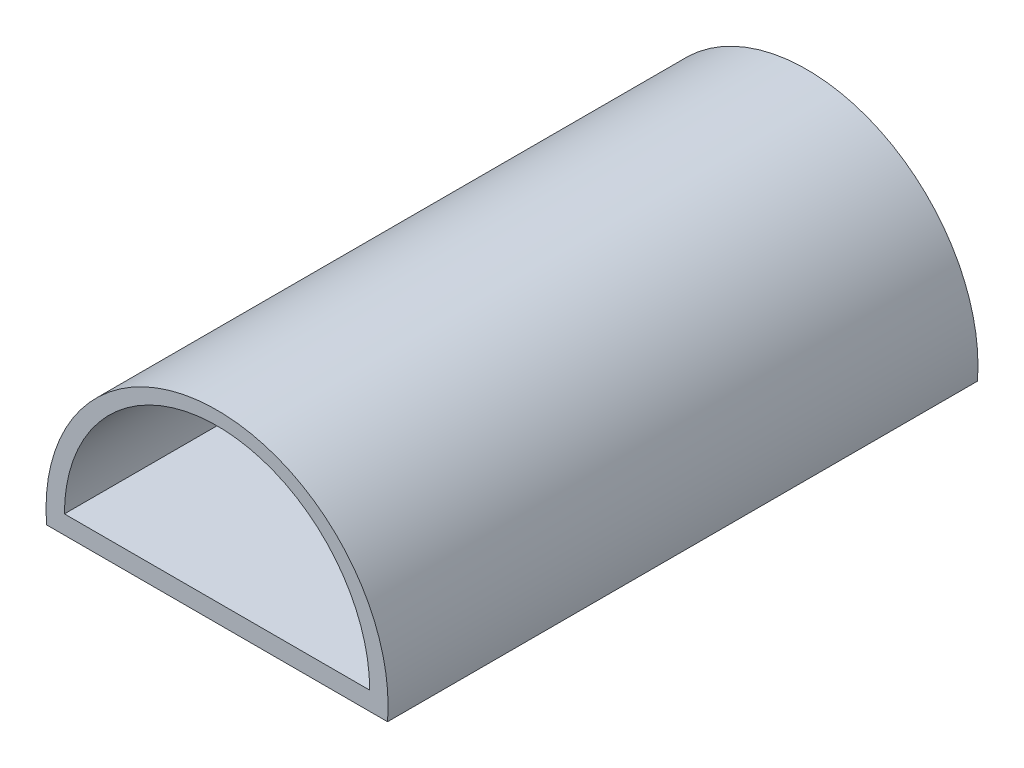
ISO-10303-21;
HEADER;
FILE_DESCRIPTION(('STEP AP214'),'2;1');
FILE_NAME('part.step','',(''),(''),'','','');
FILE_SCHEMA(('AUTOMOTIVE_DESIGN { 1 0 10303 214 1 1 1 1 }'));
ENDSEC;
DATA;
#1=APPLICATION_CONTEXT('core data for automotive mechanical design processes');
#2=APPLICATION_PROTOCOL_DEFINITION('international standard','automotive_design',2000,#1);
#3=PRODUCT_CONTEXT('',#1,'mechanical');
#4=PRODUCT('Part','Part','',(#3));
#5=PRODUCT_RELATED_PRODUCT_CATEGORY('part','',(#4));
#6=PRODUCT_DEFINITION_FORMATION('','',#4);
#7=PRODUCT_DEFINITION_CONTEXT('part definition',#1,'design');
#8=PRODUCT_DEFINITION('design','',#6,#7);
#9=PRODUCT_DEFINITION_SHAPE('','',#8);
#10=(LENGTH_UNIT() NAMED_UNIT(*) SI_UNIT(.MILLI.,.METRE.));
#11=(NAMED_UNIT(*) PLANE_ANGLE_UNIT() SI_UNIT($,.RADIAN.));
#12=(NAMED_UNIT(*) SI_UNIT($,.STERADIAN.) SOLID_ANGLE_UNIT());
#13=UNCERTAINTY_MEASURE_WITH_UNIT(LENGTH_MEASURE(1.E-05),#10,'distance_accuracy_value','');
#14=(GEOMETRIC_REPRESENTATION_CONTEXT(3) GLOBAL_UNCERTAINTY_ASSIGNED_CONTEXT((#13)) GLOBAL_UNIT_ASSIGNED_CONTEXT((#10,
#11,#12)) REPRESENTATION_CONTEXT('',''));
#15=CARTESIAN_POINT('',(0.,0.,0.));
#16=DIRECTION('',(0.,0.,1.));
#17=DIRECTION('',(1.,0.,0.));
#18=AXIS2_PLACEMENT_3D('',#15,#16,#17);
#19=CARTESIAN_POINT('',(-8.42700279293845,-8.87685553456328,50.8));
#20=DIRECTION('',(0.,0.,-1.));
#21=DIRECTION('',(-1.,0.,0.));
#22=AXIS2_PLACEMENT_3D('',#19,#20,#21);
#23=PLANE('',#22);
#24=CARTESIAN_POINT('',(-8.42700279293845,-8.87685553456328,50.8));
#25=DIRECTION('',(0.,0.,1.));
#26=DIRECTION('',(-1.,0.,0.));
#27=AXIS2_PLACEMENT_3D('',#24,#25,#26);
#28=CIRCLE('',#27,14.7310367744908);
#29=CARTESIAN_POINT('',(6.25737220706155,-10.0484251273645,50.8));
#30=VERTEX_POINT('',#29);
#31=CARTESIAN_POINT('',(-23.1113777929385,-10.0484251273645,50.8));
#32=VERTEX_POINT('',#31);
#33=EDGE_CURVE('E103',#30,#32,#28,.T.);
#34=ORIENTED_EDGE('',*,*,#33,.T.);
#35=DIRECTION('',(1.,0.,0.));
#36=VECTOR('',#35,1.);
#37=CARTESIAN_POINT('',(-23.1113777929385,-10.0484251273645,50.8));
#38=LINE('',#37,#36);
#39=EDGE_CURVE('E107',#32,#30,#38,.T.);
#40=ORIENTED_EDGE('',*,*,#39,.T.);
#41=EDGE_LOOP('',(#34,#40));
#42=FACE_BOUND('',#41,.T.);
#43=CARTESIAN_POINT('',(-8.42700279293845,-8.46092512736455,50.8));
#44=DIRECTION('',(0.,0.,1.));
#45=DIRECTION('',(-1.,0.,0.));
#46=AXIS2_PLACEMENT_3D('',#43,#44,#45);
#47=CIRCLE('',#46,13.1445);
#48=CARTESIAN_POINT('',(4.71749720706154,-8.46092512736455,50.8));
#49=VERTEX_POINT('',#48);
#50=CARTESIAN_POINT('',(-21.5715027929384,-8.46092512736455,50.8));
#51=VERTEX_POINT('',#50);
#52=EDGE_CURVE('E83',#49,#51,#47,.T.);
#53=ORIENTED_EDGE('',*,*,#52,.F.);
#54=DIRECTION('',(1.,0.,0.));
#55=VECTOR('',#54,1.);
#56=CARTESIAN_POINT('',(-8.42700279293845,-8.46092512736455,50.8));
#57=LINE('',#56,#55);
#58=EDGE_CURVE('E78',#51,#49,#57,.T.);
#59=ORIENTED_EDGE('',*,*,#58,.F.);
#60=EDGE_LOOP('',(#53,#59));
#61=FACE_BOUND('',#60,.T.);
#62=ADVANCED_FACE('F39',(#42,#61),#23,.F.);
#63=CARTESIAN_POINT('',(-8.42700279293845,-8.87685553456328,0.));
#64=DIRECTION('',(0.,0.,-1.));
#65=DIRECTION('',(-1.,0.,0.));
#66=AXIS2_PLACEMENT_3D('',#63,#64,#65);
#67=PLANE('',#66);
#68=CARTESIAN_POINT('',(-8.42700279293845,-8.87685553456328,0.));
#69=DIRECTION('',(0.,0.,1.));
#70=DIRECTION('',(-1.,0.,0.));
#71=AXIS2_PLACEMENT_3D('',#68,#69,#70);
#72=CIRCLE('',#71,14.7310367744908);
#73=CARTESIAN_POINT('',(6.25737220706155,-10.0484251273645,0.));
#74=VERTEX_POINT('',#73);
#75=CARTESIAN_POINT('',(-23.1113777929385,-10.0484251273645,0.));
#76=VERTEX_POINT('',#75);
#77=EDGE_CURVE('E92',#74,#76,#72,.T.);
#78=ORIENTED_EDGE('',*,*,#77,.F.);
#79=DIRECTION('',(1.,0.,0.));
#80=VECTOR('',#79,1.);
#81=CARTESIAN_POINT('',(-23.1113777929385,-10.0484251273645,0.));
#82=LINE('',#81,#80);
#83=EDGE_CURVE('E108',#76,#74,#82,.T.);
#84=ORIENTED_EDGE('',*,*,#83,.F.);
#85=EDGE_LOOP('',(#78,#84));
#86=FACE_BOUND('',#85,.T.);
#87=DIRECTION('',(1.,0.,0.));
#88=VECTOR('',#87,1.);
#89=CARTESIAN_POINT('',(-8.42700279293845,-8.46092512736455,0.));
#90=LINE('',#89,#88);
#91=CARTESIAN_POINT('',(-21.5715027929384,-8.46092512736455,0.));
#92=VERTEX_POINT('',#91);
#93=CARTESIAN_POINT('',(4.71749720706154,-8.46092512736455,0.));
#94=VERTEX_POINT('',#93);
#95=EDGE_CURVE('E84',#92,#94,#90,.T.);
#96=ORIENTED_EDGE('',*,*,#95,.T.);
#97=CARTESIAN_POINT('',(-8.42700279293845,-8.46092512736455,0.));
#98=DIRECTION('',(0.,0.,1.));
#99=DIRECTION('',(-1.,0.,0.));
#100=AXIS2_PLACEMENT_3D('',#97,#98,#99);
#101=CIRCLE('',#100,13.1445);
#102=EDGE_CURVE('E89',#94,#92,#101,.T.);
#103=ORIENTED_EDGE('',*,*,#102,.T.);
#104=EDGE_LOOP('',(#96,#103));
#105=FACE_BOUND('',#104,.T.);
#106=ADVANCED_FACE('F124',(#86,#105),#67,.T.);
#107=CARTESIAN_POINT('',(-8.42700279293845,-8.87685553456328,50.8));
#108=DIRECTION('',(0.,0.,-1.));
#109=DIRECTION('',(-1.,0.,0.));
#110=AXIS2_PLACEMENT_3D('',#107,#108,#109);
#111=CYLINDRICAL_SURFACE('',#110,14.7310367744908);
#112=ORIENTED_EDGE('',*,*,#77,.T.);
#113=DIRECTION('',(0.,0.,-1.));
#114=VECTOR('',#113,1.);
#115=CARTESIAN_POINT('',(-23.1113777929385,-10.0484251273645,50.8));
#116=LINE('',#115,#114);
#117=EDGE_CURVE('E11',#32,#76,#116,.T.);
#118=ORIENTED_EDGE('',*,*,#117,.F.);
#119=ORIENTED_EDGE('',*,*,#33,.F.);
#120=DIRECTION('',(0.,0.,-1.));
#121=VECTOR('',#120,1.);
#122=CARTESIAN_POINT('',(6.25737220706155,-10.0484251273645,50.8));
#123=LINE('',#122,#121);
#124=EDGE_CURVE('E48',#30,#74,#123,.T.);
#125=ORIENTED_EDGE('',*,*,#124,.T.);
#126=EDGE_LOOP('',(#112,#118,#119,#125));
#127=FACE_BOUND('',#126,.T.);
#128=ADVANCED_FACE('F41',(#127),#111,.T.);
#129=CARTESIAN_POINT('',(-23.1113777929385,-10.0484251273645,50.8));
#130=DIRECTION('',(0.,1.,0.));
#131=DIRECTION('',(0.,0.,1.));
#132=AXIS2_PLACEMENT_3D('',#129,#130,#131);
#133=PLANE('',#132);
#134=ORIENTED_EDGE('',*,*,#83,.T.);
#135=ORIENTED_EDGE('',*,*,#124,.F.);
#136=ORIENTED_EDGE('',*,*,#39,.F.);
#137=ORIENTED_EDGE('',*,*,#117,.T.);
#138=EDGE_LOOP('',(#134,#135,#136,#137));
#139=FACE_BOUND('',#138,.T.);
#140=ADVANCED_FACE('F126',(#139),#133,.F.);
#141=CARTESIAN_POINT('',(-8.42700279293845,-8.46092512736455,50.8));
#142=DIRECTION('',(0.,0.,-1.));
#143=DIRECTION('',(-1.,0.,0.));
#144=AXIS2_PLACEMENT_3D('',#141,#142,#143);
#145=CYLINDRICAL_SURFACE('',#144,13.1445);
#146=ORIENTED_EDGE('',*,*,#102,.F.);
#147=DIRECTION('',(0.,0.,-1.));
#148=VECTOR('',#147,1.);
#149=CARTESIAN_POINT('',(4.71749720706154,-8.46092512736455,50.8));
#150=LINE('',#149,#148);
#151=EDGE_CURVE('E60',#49,#94,#150,.T.);
#152=ORIENTED_EDGE('',*,*,#151,.F.);
#153=ORIENTED_EDGE('',*,*,#52,.T.);
#154=DIRECTION('',(0.,0.,-1.));
#155=VECTOR('',#154,1.);
#156=CARTESIAN_POINT('',(-21.5715027929384,-8.46092512736455,50.8));
#157=LINE('',#156,#155);
#158=EDGE_CURVE('E55',#51,#92,#157,.T.);
#159=ORIENTED_EDGE('',*,*,#158,.T.);
#160=EDGE_LOOP('',(#146,#152,#153,#159));
#161=FACE_BOUND('',#160,.T.);
#162=ADVANCED_FACE('F87',(#161),#145,.F.);
#163=CARTESIAN_POINT('',(-8.42700279293845,-8.46092512736455,50.8));
#164=DIRECTION('',(0.,1.,0.));
#165=DIRECTION('',(-1.,0.,0.));
#166=AXIS2_PLACEMENT_3D('',#163,#164,#165);
#167=PLANE('',#166);
#168=ORIENTED_EDGE('',*,*,#95,.F.);
#169=ORIENTED_EDGE('',*,*,#158,.F.);
#170=ORIENTED_EDGE('',*,*,#58,.T.);
#171=ORIENTED_EDGE('',*,*,#151,.T.);
#172=EDGE_LOOP('',(#168,#169,#170,#171));
#173=FACE_BOUND('',#172,.T.);
#174=ADVANCED_FACE('F79',(#173),#167,.T.);
#175=CLOSED_SHELL('',(#62,#106,#128,#140,#162,#174));
#176=MANIFOLD_SOLID_BREP('B2',#175);
#177=ADVANCED_BREP_SHAPE_REPRESENTATION('',(#18,#176),#14);
#178=SHAPE_DEFINITION_REPRESENTATION(#9,#177);
ENDSEC;
END-ISO-10303-21;
